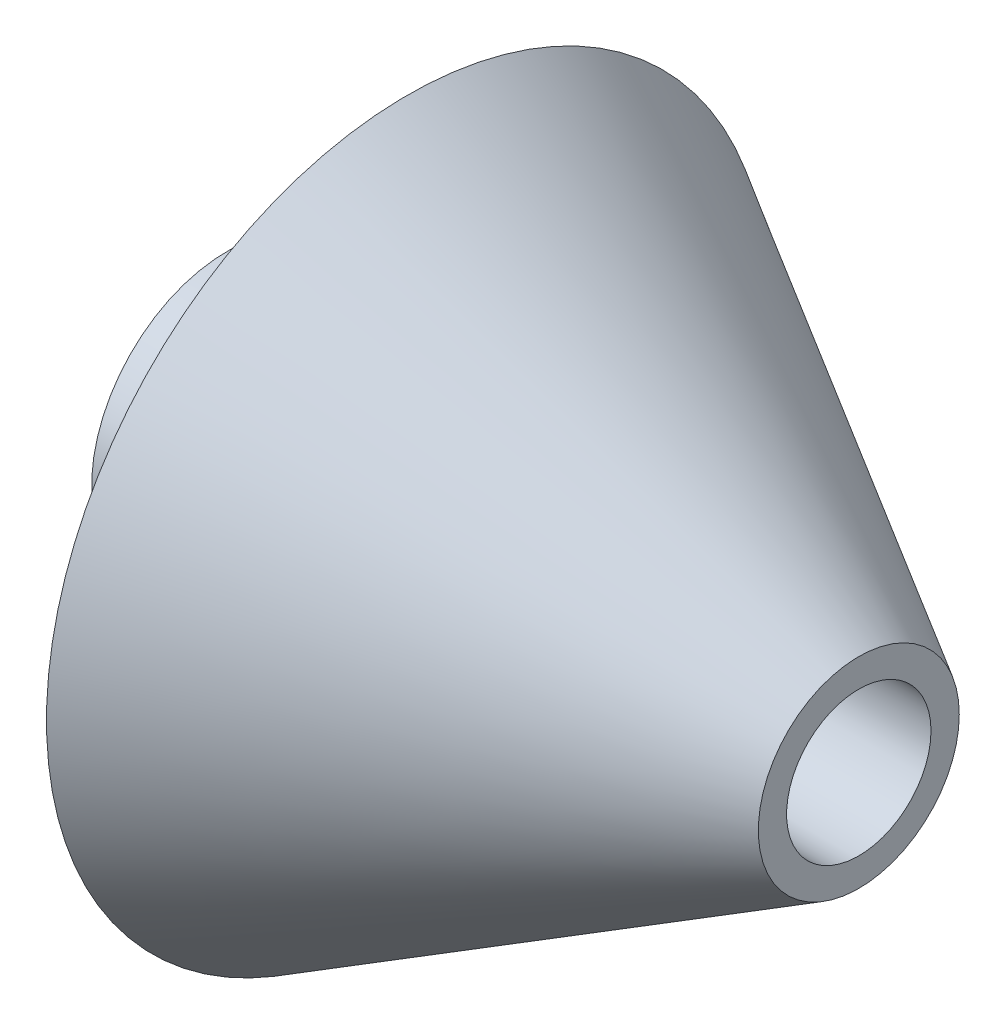
ISO-10303-21;
HEADER;
FILE_DESCRIPTION(('STEP AP214'),'2;1');
FILE_NAME('part.step','',(''),(''),'','','');
FILE_SCHEMA(('AUTOMOTIVE_DESIGN { 1 0 10303 214 1 1 1 1 }'));
ENDSEC;
DATA;
#1=APPLICATION_CONTEXT('core data for automotive mechanical design processes');
#2=APPLICATION_PROTOCOL_DEFINITION('international standard','automotive_design',2000,#1);
#3=PRODUCT_CONTEXT('',#1,'mechanical');
#4=PRODUCT('Part','Part','',(#3));
#5=PRODUCT_RELATED_PRODUCT_CATEGORY('part','',(#4));
#6=PRODUCT_DEFINITION_FORMATION('','',#4);
#7=PRODUCT_DEFINITION_CONTEXT('part definition',#1,'design');
#8=PRODUCT_DEFINITION('design','',#6,#7);
#9=PRODUCT_DEFINITION_SHAPE('','',#8);
#10=(LENGTH_UNIT() NAMED_UNIT(*) SI_UNIT(.MILLI.,.METRE.));
#11=(NAMED_UNIT(*) PLANE_ANGLE_UNIT() SI_UNIT($,.RADIAN.));
#12=(NAMED_UNIT(*) SI_UNIT($,.STERADIAN.) SOLID_ANGLE_UNIT());
#13=UNCERTAINTY_MEASURE_WITH_UNIT(LENGTH_MEASURE(1.E-05),#10,'distance_accuracy_value','');
#14=(GEOMETRIC_REPRESENTATION_CONTEXT(3) GLOBAL_UNCERTAINTY_ASSIGNED_CONTEXT((#13)) GLOBAL_UNIT_ASSIGNED_CONTEXT((#10,
#11,#12)) REPRESENTATION_CONTEXT('',''));
#15=CARTESIAN_POINT('',(0.,0.,0.));
#16=DIRECTION('',(0.,0.,1.));
#17=DIRECTION('',(1.,0.,0.));
#18=AXIS2_PLACEMENT_3D('',#15,#16,#17);
#19=CARTESIAN_POINT('',(10.,0.,0.));
#20=DIRECTION('',(-1.,0.,0.));
#21=DIRECTION('',(0.,0.,1.));
#22=AXIS2_PLACEMENT_3D('',#19,#20,#21);
#23=CYLINDRICAL_SURFACE('',#22,7.5);
#24=CARTESIAN_POINT('',(5.,7.29582462191344,1.73808604110431));
#25=CARTESIAN_POINT('',(4.8767081780864,7.29582578533876,1.73808441921809));
#26=CARTESIAN_POINT('',(4.75340116378396,7.29831884775625,1.72771516807284));
#27=CARTESIAN_POINT('',(4.51039212561209,7.30791907483883,1.68663890552692));
#28=CARTESIAN_POINT('',(4.3906913202478,7.31502778118994,1.65592509870683));
#29=CARTESIAN_POINT('',(4.1584479075924,7.33279943339759,1.57535296806255));
#30=CARTESIAN_POINT('',(4.04589375555037,7.34345646386681,1.5255264859684));
#31=CARTESIAN_POINT('',(3.83056709900705,7.36682831501832,1.4083313365412));
#32=CARTESIAN_POINT('',(3.72779606197334,7.3795434436454,1.34096004313002));
#33=CARTESIAN_POINT('',(3.53170041413394,7.40566220817689,1.18840702692507));
#34=CARTESIAN_POINT('',(3.43873115308057,7.41907513202254,1.10277001429896));
#35=CARTESIAN_POINT('',(3.26804307301624,7.44428964409016,0.917226899043463));
#36=CARTESIAN_POINT('',(3.19032621432518,7.45609102512884,0.817318965086769));
#37=CARTESIAN_POINT('',(3.05080595025004,7.47645447792517,0.603627500265013));
#38=CARTESIAN_POINT('',(2.98936486333579,7.48494451538182,0.489599753162261));
#39=CARTESIAN_POINT('',(2.88651911143587,7.49668291516818,0.252585901676565));
#40=CARTESIAN_POINT('',(2.84511012521383,7.49993240831827,0.129601735924405));
#41=CARTESIAN_POINT('',(2.78467999836424,7.50006356854545,-0.118033583608461));
#42=CARTESIAN_POINT('',(2.76505230852095,7.49712473693507,-0.242536409879433));
#43=CARTESIAN_POINT('',(2.74682401303034,7.48484294070182,-0.492748916896022));
#44=CARTESIAN_POINT('',(2.74821899089706,7.47550132158353,-0.61845833861195));
#45=CARTESIAN_POINT('',(2.77158930281454,7.45113461963631,-0.863281957222159));
#46=CARTESIAN_POINT('',(2.7929077907148,7.43630001528748,-0.982478693202047));
#47=CARTESIAN_POINT('',(2.85444700399144,7.40184054195606,-1.21515294249028));
#48=CARTESIAN_POINT('',(2.89466892641401,7.38221536965206,-1.3286300931061));
#49=CARTESIAN_POINT('',(2.99331803512784,7.33931843955883,-1.54825090295519));
#50=CARTESIAN_POINT('',(3.0519518042109,7.31600687177091,-1.65429375421843));
#51=CARTESIAN_POINT('',(3.18559677864234,7.26769334295043,-1.85507770750856));
#52=CARTESIAN_POINT('',(3.26061186944523,7.24269098185471,-1.94981611999905));
#53=CARTESIAN_POINT('',(3.4282966261274,7.19203086420685,-2.12925466018726));
#54=CARTESIAN_POINT('',(3.52153537854461,7.16638499638598,-2.21342704616745));
#55=CARTESIAN_POINT('',(3.72126502683508,7.11773406341157,-2.36521278353643));
#56=CARTESIAN_POINT('',(3.82775723808385,7.09472926081401,-2.43282448933589));
#57=CARTESIAN_POINT('',(4.05235920387348,7.0533901371112,-2.55021857579199));
#58=CARTESIAN_POINT('',(4.17057056879438,7.03510271737461,-2.5998237710279));
#59=CARTESIAN_POINT('',(4.41441081266832,7.0054564081845,-2.67868922849804));
#60=CARTESIAN_POINT('',(4.54003725730184,6.99409525860799,-2.70795612779274));
#61=CARTESIAN_POINT('',(4.79012354110892,6.97986823780215,-2.74441441642579));
#62=CARTESIAN_POINT('',(4.91445233584097,6.97670150821491,-2.75238796025694));
#63=CARTESIAN_POINT('',(5.1627093500148,6.97833930387089,-2.74823345305454));
#64=CARTESIAN_POINT('',(5.28663762309627,6.98314271328774,-2.73610821586802));
#65=CARTESIAN_POINT('',(5.52723256695631,6.99996360645724,-2.69277185685859));
#66=CARTESIAN_POINT('',(5.64400424639528,7.01179043634496,-2.66206474422851));
#67=CARTESIAN_POINT('',(5.87060253622238,7.04131123187629,-2.58296466630633));
#68=CARTESIAN_POINT('',(5.98042807121085,7.05900610337334,-2.53456897029808));
#69=CARTESIAN_POINT('',(6.1932761961082,7.09914564270398,-2.41989779964394));
#70=CARTESIAN_POINT('',(6.29603708147869,7.12170504697062,-2.35317729920291));
#71=CARTESIAN_POINT('',(6.48895715927121,7.16922250909264,-2.20416727666842));
#72=CARTESIAN_POINT('',(6.57911332641918,7.19418114037205,-2.12187402805649));
#73=CARTESIAN_POINT('',(6.7477706087221,7.24532058841136,-1.94024373790255));
#74=CARTESIAN_POINT('',(6.82570344348047,7.27151198137408,-1.84038066945645));
#75=CARTESIAN_POINT('',(6.96345005154163,7.32189833056559,-1.62839079479818));
#76=CARTESIAN_POINT('',(7.02326472467219,7.34609338589786,-1.51626459800359));
#77=CARTESIAN_POINT('',(7.12250004585244,7.39028649297591,-1.2835763100187));
#78=CARTESIAN_POINT('',(7.16207302423846,7.41031519980201,-1.16308521973277));
#79=CARTESIAN_POINT('',(7.22009137833563,7.44484796656302,-0.916368390195936));
#80=CARTESIAN_POINT('',(7.23854279892263,7.45935360637634,-0.790144302455321));
#81=CARTESIAN_POINT('',(7.25333456608175,7.48148849999798,-0.540742826239007));
#82=CARTESIAN_POINT('',(7.25049904311175,7.48936105039222,-0.417635301209565));
#83=CARTESIAN_POINT('',(7.22476755125132,7.49899415973435,-0.173303016696191));
#84=CARTESIAN_POINT('',(7.20187271977934,7.50075506520139,-0.0520781508569035));
#85=CARTESIAN_POINT('',(7.13718250790056,7.49866714154556,0.183739659865865));
#86=CARTESIAN_POINT('',(7.09559272902648,7.49487834888372,0.2983898420966));
#87=CARTESIAN_POINT('',(6.99487712823921,7.48280968580673,0.519449471297491));
#88=CARTESIAN_POINT('',(6.93574842457071,7.4745290771726,0.625857560413855));
#89=CARTESIAN_POINT('',(6.79943981385495,7.45455263671726,0.831033074447341));
#90=CARTESIAN_POINT('',(6.72174285499885,7.44275600496553,0.929447075633607));
#91=CARTESIAN_POINT('',(6.5514344175008,7.41764997770358,1.11220275729975));
#92=CARTESIAN_POINT('',(6.45881864315277,7.40434014681033,1.19654037035669));
#93=CARTESIAN_POINT('',(6.25798883253424,7.37771661499368,1.35116526055005));
#94=CARTESIAN_POINT('',(6.14939216991434,7.36441462190377,1.42095885796911));
#95=CARTESIAN_POINT('',(5.92166723875847,7.34023484572542,1.54101414244782));
#96=CARTESIAN_POINT('',(5.80254406459821,7.32935589886509,1.59128521470233));
#97=CARTESIAN_POINT('',(5.57038935259059,7.31265633349442,1.66624403033643));
#98=CARTESIAN_POINT('',(5.45808702960351,7.30641663081895,1.6931066541507));
#99=CARTESIAN_POINT('',(5.23052716625634,7.29800063846268,1.72902663298082));
#100=CARTESIAN_POINT('',(5.11527022303213,7.29582353418277,1.73808755746755));
#101=CARTESIAN_POINT('',(5.,7.29582462191344,1.73808604110431));
#102=B_SPLINE_CURVE_WITH_KNOTS('',3,(#24,#25,#26,#27,#28,#29,#30,#31,#32,#33,#34,#35,#36,#37,
#38,#39,#40,#41,#42,#43,#44,#45,#46,#47,#48,#49,#50,#51,#52,#53,#54,#55,#56,#57,#58,#59,#60,#61,
#62,#63,#64,#65,#66,#67,#68,#69,#70,#71,#72,#73,#74,#75,#76,#77,#78,#79,#80,#81,#82,#83,#84,#85,
#86,#87,#88,#89,#90,#91,#92,#93,#94,#95,#96,#97,#98,#99,#100,#101),.UNSPECIFIED.,.T.,.F.,(4,2,2,
2,2,2,2,2,2,2,2,2,2,2,2,2,2,2,2,2,2,2,2,2,2,2,2,2,2,2,2,2,2,2,2,2,2,2,4),(0.,0.369450248873314,
0.739023962533499,1.10798462169929,1.47700053805515,1.85659725011976,2.23624271806909,
2.62373908910467,3.01115183381815,3.38748210224336,3.7637333115216,4.1280018898632,
4.49229353835564,4.86082814003514,5.22945024886245,5.61228220534916,5.99515218737794,
6.38169357369399,6.76810875942617,7.14012121185464,7.51208158661081,7.87437892408225,
8.23673221568681,8.60881097714082,8.98097888893384,9.36719259150903,9.75338710986302,
10.1366308772149,10.5197649348252,10.8881445586683,11.2565032957163,11.6209064530833,
11.9853695173707,12.3614944058173,12.7377277894483,13.1251745950372,13.5124349094592,
13.8579173078617,14.2033304255034),.UNSPECIFIED.);
#103=CARTESIAN_POINT('',(5.,7.29582462191344,1.73808604110431));
#104=VERTEX_POINT('',#103);
#105=EDGE_CURVE('E55',#104,#104,#102,.T.);
#106=ORIENTED_EDGE('',*,*,#105,.T.);
#107=EDGE_LOOP('',(#106));
#108=FACE_BOUND('',#107,.T.);
#109=CARTESIAN_POINT('',(10.,0.,0.));
#110=DIRECTION('',(1.,0.,0.));
#111=DIRECTION('',(0.,0.,-1.));
#112=AXIS2_PLACEMENT_3D('',#109,#110,#111);
#113=CIRCLE('',#112,7.5);
#114=CARTESIAN_POINT('',(10.,0.,-7.5));
#115=VERTEX_POINT('',#114);
#116=EDGE_CURVE('E10',#115,#115,#113,.T.);
#117=ORIENTED_EDGE('',*,*,#116,.F.);
#118=EDGE_LOOP('',(#117));
#119=FACE_BOUND('',#118,.T.);
#120=CARTESIAN_POINT('',(0.,0.,0.));
#121=DIRECTION('',(1.,0.,0.));
#122=DIRECTION('',(0.,0.,-1.));
#123=AXIS2_PLACEMENT_3D('',#120,#121,#122);
#124=CIRCLE('',#123,7.5);
#125=CARTESIAN_POINT('',(0.,0.,-7.5));
#126=VERTEX_POINT('',#125);
#127=EDGE_CURVE('E35',#126,#126,#124,.T.);
#128=ORIENTED_EDGE('',*,*,#127,.T.);
#129=EDGE_LOOP('',(#128));
#130=FACE_BOUND('',#129,.T.);
#131=ADVANCED_FACE('F31',(#108,#119,#130),#23,.T.);
#132=CARTESIAN_POINT('',(0.,0.,0.));
#133=DIRECTION('',(1.,0.,0.));
#134=DIRECTION('',(0.,0.,-1.));
#135=AXIS2_PLACEMENT_3D('',#132,#133,#134);
#136=PLANE('',#135);
#137=CARTESIAN_POINT('',(0.,0.,0.));
#138=DIRECTION('',(1.,0.,0.));
#139=DIRECTION('',(0.,0.,-1.));
#140=AXIS2_PLACEMENT_3D('',#137,#138,#139);
#141=CIRCLE('',#140,4.);
#142=CARTESIAN_POINT('',(0.,0.,-4.));
#143=VERTEX_POINT('',#142);
#144=EDGE_CURVE('E49',#143,#143,#141,.T.);
#145=ORIENTED_EDGE('',*,*,#144,.T.);
#146=EDGE_LOOP('',(#145));
#147=FACE_BOUND('',#146,.T.);
#148=ORIENTED_EDGE('',*,*,#127,.F.);
#149=EDGE_LOOP('',(#148));
#150=FACE_BOUND('',#149,.T.);
#151=ADVANCED_FACE('F84',(#147,#150),#136,.F.);
#152=CARTESIAN_POINT('',(10.,0.,0.));
#153=DIRECTION('',(1.,0.,0.));
#154=DIRECTION('',(0.,0.,-1.));
#155=AXIS2_PLACEMENT_3D('',#152,#153,#154);
#156=PLANE('',#155);
#157=CARTESIAN_POINT('',(10.,0.,0.));
#158=DIRECTION('',(1.,0.,0.));
#159=DIRECTION('',(0.,0.,-1.));
#160=AXIS2_PLACEMENT_3D('',#157,#158,#159);
#161=CIRCLE('',#160,20.);
#162=CARTESIAN_POINT('',(10.,0.,-20.));
#163=VERTEX_POINT('',#162);
#164=EDGE_CURVE('E46',#163,#163,#161,.T.);
#165=ORIENTED_EDGE('',*,*,#164,.F.);
#166=EDGE_LOOP('',(#165));
#167=FACE_BOUND('',#166,.T.);
#168=ORIENTED_EDGE('',*,*,#116,.T.);
#169=EDGE_LOOP('',(#168));
#170=FACE_BOUND('',#169,.T.);
#171=ADVANCED_FACE('F81',(#167,#170),#156,.F.);
#172=CARTESIAN_POINT('',(10.,0.,0.));
#173=DIRECTION('',(-1.,0.,0.));
#174=DIRECTION('',(0.,0.,-1.));
#175=AXIS2_PLACEMENT_3D('',#172,#173,#174);
#176=CONICAL_SURFACE('',#175,20.,0.5235987755983);
#177=CARTESIAN_POINT('',(35.,0.,0.));
#178=DIRECTION('',(1.,0.,0.));
#179=DIRECTION('',(0.,0.,-1.));
#180=AXIS2_PLACEMENT_3D('',#177,#178,#179);
#181=CIRCLE('',#180,5.56624327025932);
#182=CARTESIAN_POINT('',(35.,0.,-5.56624327025932));
#183=VERTEX_POINT('',#182);
#184=EDGE_CURVE('E42',#183,#183,#181,.T.);
#185=CARTESIAN_POINT('',(35.,0.,-5.56624327025932));
#186=CARTESIAN_POINT('',(34.7395833333333,0.,-5.71659490286078));
#187=CARTESIAN_POINT('',(34.4791666666667,0.,-5.86694653546225));
#188=CARTESIAN_POINT('',(33.9583333333333,0.,-6.16764980066518));
#189=CARTESIAN_POINT('',(33.6979166666667,0.,-6.31800143326665));
#190=CARTESIAN_POINT('',(33.1770833333333,0.,-6.61870469846958));
#191=CARTESIAN_POINT('',(32.9166666666667,0.,-6.76905633107104));
#192=CARTESIAN_POINT('',(32.3958333333333,0.,-7.06975959627397));
#193=CARTESIAN_POINT('',(32.1354166666667,0.,-7.22011122887544));
#194=CARTESIAN_POINT('',(31.6145833333333,0.,-7.52081449407837));
#195=CARTESIAN_POINT('',(31.3541666666667,0.,-7.67116612667983));
#196=CARTESIAN_POINT('',(30.8333333333333,0.,-7.97186939188277));
#197=CARTESIAN_POINT('',(30.5729166666667,0.,-8.12222102448423));
#198=CARTESIAN_POINT('',(30.0520833333333,0.,-8.42292428968716));
#199=CARTESIAN_POINT('',(29.7916666666667,0.,-8.57327592228863));
#200=CARTESIAN_POINT('',(29.2708333333333,0.,-8.87397918749156));
#201=CARTESIAN_POINT('',(29.0104166666667,0.,-9.02433082009302));
#202=CARTESIAN_POINT('',(28.4895833333333,0.,-9.32503408529595));
#203=CARTESIAN_POINT('',(28.2291666666667,0.,-9.47538571789742));
#204=CARTESIAN_POINT('',(27.7083333333333,0.,-9.77608898310035));
#205=CARTESIAN_POINT('',(27.4479166666667,0.,-9.92644061570181));
#206=CARTESIAN_POINT('',(26.9270833333333,0.,-10.2271438809047));
#207=CARTESIAN_POINT('',(26.6666666666667,0.,-10.3774955135062));
#208=CARTESIAN_POINT('',(26.1458333333333,0.,-10.6781987787091));
#209=CARTESIAN_POINT('',(25.8854166666667,0.,-10.8285504113106));
#210=CARTESIAN_POINT('',(25.3645833333333,0.,-11.1292536765135));
#211=CARTESIAN_POINT('',(25.1041666666667,0.,-11.279605309115));
#212=CARTESIAN_POINT('',(24.5833333333333,0.,-11.5803085743179));
#213=CARTESIAN_POINT('',(24.3229166666667,0.,-11.7306602069194));
#214=CARTESIAN_POINT('',(23.8020833333333,0.,-12.0313634721223));
#215=CARTESIAN_POINT('',(23.5416666666667,0.,-12.1817151047238));
#216=CARTESIAN_POINT('',(23.0208333333333,0.,-12.4824183699267));
#217=CARTESIAN_POINT('',(22.7604166666667,0.,-12.6327700025282));
#218=CARTESIAN_POINT('',(22.2395833333333,0.,-12.9334732677311));
#219=CARTESIAN_POINT('',(21.9791666666667,0.,-13.0838249003326));
#220=CARTESIAN_POINT('',(21.4583333333333,0.,-13.3845281655355));
#221=CARTESIAN_POINT('',(21.1979166666667,0.,-13.534879798137));
#222=CARTESIAN_POINT('',(20.6770833333333,0.,-13.8355830633399));
#223=CARTESIAN_POINT('',(20.4166666666667,0.,-13.9859346959414));
#224=CARTESIAN_POINT('',(19.8958333333333,0.,-14.2866379611443));
#225=CARTESIAN_POINT('',(19.6354166666667,0.,-14.4369895937458));
#226=CARTESIAN_POINT('',(19.1145833333333,0.,-14.7376928589487));
#227=CARTESIAN_POINT('',(18.8541666666667,0.,-14.8880444915502));
#228=CARTESIAN_POINT('',(18.3333333333333,0.,-15.1887477567531));
#229=CARTESIAN_POINT('',(18.0729166666667,0.,-15.3390993893546));
#230=CARTESIAN_POINT('',(17.5520833333333,0.,-15.6398026545575));
#231=CARTESIAN_POINT('',(17.2916666666667,0.,-15.790154287159));
#232=CARTESIAN_POINT('',(16.7708333333333,0.,-16.0908575523619));
#233=CARTESIAN_POINT('',(16.5104166666667,0.,-16.2412091849634));
#234=CARTESIAN_POINT('',(15.9895833333333,0.,-16.5419124501663));
#235=CARTESIAN_POINT('',(15.7291666666667,0.,-16.6922640827678));
#236=CARTESIAN_POINT('',(15.2083333333333,0.,-16.9929673479707));
#237=CARTESIAN_POINT('',(14.9479166666667,0.,-17.1433189805722));
#238=CARTESIAN_POINT('',(14.4270833333333,0.,-17.4440222457751));
#239=CARTESIAN_POINT('',(14.1666666666667,0.,-17.5943738783766));
#240=CARTESIAN_POINT('',(13.6458333333333,0.,-17.8950771435795));
#241=CARTESIAN_POINT('',(13.3854166666667,0.,-18.045428776181));
#242=CARTESIAN_POINT('',(12.8645833333333,0.,-18.3461320413839));
#243=CARTESIAN_POINT('',(12.6041666666667,0.,-18.4964836739853));
#244=CARTESIAN_POINT('',(12.0833333333333,0.,-18.7971869391883));
#245=CARTESIAN_POINT('',(11.8229166666667,0.,-18.9475385717897));
#246=CARTESIAN_POINT('',(11.3020833333333,0.,-19.2482418369927));
#247=CARTESIAN_POINT('',(11.0416666666667,0.,-19.3985934695941));
#248=CARTESIAN_POINT('',(10.5208333333333,0.,-19.6992967347971));
#249=CARTESIAN_POINT('',(10.2604166666667,0.,-19.8496483673985));
#250=CARTESIAN_POINT('',(10.,0.,-20.));
#251=B_SPLINE_CURVE_WITH_KNOTS('',3,(#185,#186,#187,#188,#189,#190,#191,#192,#193,#194,#195,
#196,#197,#198,#199,#200,#201,#202,#203,#204,#205,#206,#207,#208,#209,#210,#211,#212,#213,#214,
#215,#216,#217,#218,#219,#220,#221,#222,#223,#224,#225,#226,#227,#228,#229,#230,#231,#232,#233,
#234,#235,#236,#237,#238,#239,#240,#241,#242,#243,#244,#245,#246,#247,#248,#249,#250),
.UNSPECIFIED.,.F.,.F.,(4,2,2,2,2,2,2,2,2,2,2,2,2,2,2,2,2,2,2,2,2,2,2,2,2,2,2,2,2,2,2,2,4),(0.,
0.902109795608795,1.80421959121758,2.70632938682637,3.60843918243517,4.51054897804395,
5.41265877365275,6.31476856926154,7.21687836487032,8.11898816047912,9.02109795608791,
9.9232077516967,10.8253175473055,11.7274273429143,12.6295371385231,13.5316469341319,
14.4337567297407,15.3358665253494,16.2379763209582,17.140086116567,18.0421959121758,
18.9443057077846,19.8464155033934,20.7485252990022,21.650635094611,22.5527448902198,
23.4548546858286,24.3569644814374,25.2590742770462,26.1611840726549,27.0632938682637,
27.9654036638725,28.8675134594813),.UNSPECIFIED.);
#252=EDGE_CURVE('BSEAM79',#183,#163,#251,.T.);
#253=ORIENTED_EDGE('',*,*,#184,.F.);
#254=ORIENTED_EDGE('',*,*,#164,.T.);
#255=ORIENTED_EDGE('',*,*,#252,.T.);
#256=ORIENTED_EDGE('',*,*,#252,.F.);
#257=EDGE_LOOP('',(#253,#255,#254,#256));
#258=FACE_BOUND('',#257,.T.);
#259=ADVANCED_FACE('F79',(#258),#176,.T.);
#260=CARTESIAN_POINT('',(35.,0.,0.));
#261=DIRECTION('',(1.,0.,0.));
#262=DIRECTION('',(0.,0.,-1.));
#263=AXIS2_PLACEMENT_3D('',#260,#261,#262);
#264=PLANE('',#263);
#265=CARTESIAN_POINT('',(35.,0.,0.));
#266=DIRECTION('',(1.,0.,0.));
#267=DIRECTION('',(0.,0.,-1.));
#268=AXIS2_PLACEMENT_3D('',#265,#266,#267);
#269=CIRCLE('',#268,4.);
#270=CARTESIAN_POINT('',(35.,0.,-4.));
#271=VERTEX_POINT('',#270);
#272=EDGE_CURVE('E52',#271,#271,#269,.T.);
#273=ORIENTED_EDGE('',*,*,#272,.F.);
#274=EDGE_LOOP('',(#273));
#275=FACE_BOUND('',#274,.T.);
#276=ORIENTED_EDGE('',*,*,#184,.T.);
#277=EDGE_LOOP('',(#276));
#278=FACE_BOUND('',#277,.T.);
#279=ADVANCED_FACE('F75',(#275,#278),#264,.T.);
#280=CARTESIAN_POINT('',(-35.,0.,0.));
#281=DIRECTION('',(1.,0.,0.));
#282=DIRECTION('',(0.,0.,-1.));
#283=AXIS2_PLACEMENT_3D('',#280,#281,#282);
#284=CYLINDRICAL_SURFACE('',#283,4.);
#285=CARTESIAN_POINT('',(5.,3.45811433735363,2.01033460642482));
#286=CARTESIAN_POINT('',(5.11479177298601,3.4581272872223,2.01032364856623));
#287=CARTESIAN_POINT('',(5.22967680097599,3.46354590980055,2.00107977596369));
#288=CARTESIAN_POINT('',(5.45571959731425,3.48429505941307,1.96471217047805));
#289=CARTESIAN_POINT('',(5.56687112580827,3.49964138844542,1.93755993137688));
#290=CARTESIAN_POINT('',(5.78171749733832,3.53769065892239,1.86716843531779));
#291=CARTESIAN_POINT('',(5.88545568309775,3.56034567315265,1.82403371808911));
#292=CARTESIAN_POINT('',(6.08446410750252,3.61014410680161,1.72337044721633));
#293=CARTESIAN_POINT('',(6.17973232492404,3.63728859316501,1.66583847032256));
#294=CARTESIAN_POINT('',(6.37021368608448,3.69619006956614,1.53105749297772));
#295=CARTESIAN_POINT('',(6.46434831480084,3.72813086275212,1.4523640853639));
#296=CARTESIAN_POINT('',(6.63936841298579,3.79049462961051,1.28081551442058));
#297=CARTESIAN_POINT('',(6.72024553824001,3.82091663905504,1.18795150262325));
#298=CARTESIAN_POINT('',(6.87371148523836,3.87955696816397,0.980640461605691));
#299=CARTESIAN_POINT('',(6.9448757715501,3.90732264022884,0.864998271539078));
#300=CARTESIAN_POINT('',(7.06661429386831,3.95334197874954,0.621592398870603));
#301=CARTESIAN_POINT('',(7.11720494073854,3.97160322981236,0.493838478079167));
#302=CARTESIAN_POINT('',(7.19174990423831,3.9945265640937,0.24162448462837));
#303=CARTESIAN_POINT('',(7.21762481450363,4.00022547057301,0.117830223586463));
#304=CARTESIAN_POINT('',(7.24843078948777,3.99976146804044,-0.132288893341635));
#305=CARTESIAN_POINT('',(7.25337863632572,3.99360806955849,-0.258611639831057));
#306=CARTESIAN_POINT('',(7.24269151733192,3.97079330938818,-0.495371614981288));
#307=CARTESIAN_POINT('',(7.22924888337169,3.95535503716824,-0.606034969884377));
#308=CARTESIAN_POINT('',(7.18623202092011,3.91604779149938,-0.822606871048774));
#309=CARTESIAN_POINT('',(7.15665654294866,3.89217816509708,-0.928515048336416));
#310=CARTESIAN_POINT('',(7.08227541042689,3.83735990512779,-1.13406647703929));
#311=CARTESIAN_POINT('',(7.03732468634712,3.80634479710947,-1.23363892589054));
#312=CARTESIAN_POINT('',(6.93380432524612,3.73944899374294,-1.42361455756465));
#313=CARTESIAN_POINT('',(6.87523051267075,3.70356680801602,-1.51401491686379));
#314=CARTESIAN_POINT('',(6.73874562980042,3.62509644890928,-1.6939128322954));
#315=CARTESIAN_POINT('',(6.65941015281099,3.58220594762675,-1.78219748258282));
#316=CARTESIAN_POINT('',(6.48736365380543,3.49656842702649,-1.94485945330759));
#317=CARTESIAN_POINT('',(6.39463801984632,3.45382161734346,-2.01922137437031));
#318=CARTESIAN_POINT('',(6.1879665563582,3.36829601636845,-2.1591472278605));
#319=CARTESIAN_POINT('',(6.07284365118137,3.32589557336124,-2.22321672823089));
#320=CARTESIAN_POINT('',(5.83043916789798,3.25107059304276,-2.33128828704761));
#321=CARTESIAN_POINT('',(5.70317187724139,3.21863451809617,-2.37531358316751));
#322=CARTESIAN_POINT('',(5.5112934182758,3.18244089718883,-2.4233068071129));
#323=CARTESIAN_POINT('',(5.44990235098741,3.17265049878655,-2.4360736010235));
#324=CARTESIAN_POINT('',(5.32585093561637,3.15670495885536,-2.45670265491584));
#325=CARTESIAN_POINT('',(5.26319137167983,3.15054763841031,-2.46456785475787));
#326=CARTESIAN_POINT('',(5.13723291808639,3.14216053466889,-2.47525236937524));
#327=CARTESIAN_POINT('',(5.07393461222905,3.139927443157,-2.47807593439737));
#328=CARTESIAN_POINT('',(4.94732201512168,3.13947608348779,-2.47864590128515));
#329=CARTESIAN_POINT('',(4.88400772678837,3.14125732244709,-2.47639292645331));
#330=CARTESIAN_POINT('',(4.71463173850526,3.15136148044073,-2.46354534546038));
#331=CARTESIAN_POINT('',(4.60909251899474,3.16333854444857,-2.44828247550563));
#332=CARTESIAN_POINT('',(4.40260392124326,3.19704518276601,-2.40409001873355));
#333=CARTESIAN_POINT('',(4.30165677777346,3.21877945074323,-2.37515385407476));
#334=CARTESIAN_POINT('',(4.1023712596773,3.27062983489866,-2.30326141434753));
#335=CARTESIAN_POINT('',(4.00429845856983,3.30104626814879,-2.25979095345306));
#336=CARTESIAN_POINT('',(3.81659989404072,3.36697540337568,-2.16033200724061));
#337=CARTESIAN_POINT('',(3.7269782010505,3.40249054055335,-2.10433753313574));
#338=CARTESIAN_POINT('',(3.54300310928209,3.48204565372015,-1.97037749056845));
#339=CARTESIAN_POINT('',(3.45036390599711,3.52651814227246,-1.890303742227));
#340=CARTESIAN_POINT('',(3.27960945170775,3.61478299621542,-1.71549964675364));
#341=CARTESIAN_POINT('',(3.2015037626183,3.65857489659275,-1.62075972497899));
#342=CARTESIAN_POINT('',(3.05777260443435,3.74425179236784,-1.41209293572753));
#343=CARTESIAN_POINT('',(2.99313387496689,3.78587882613099,-1.29737187748106));
#344=CARTESIAN_POINT('',(2.88520723884704,3.86024500507964,-1.05566668697368));
#345=CARTESIAN_POINT('',(2.84189639869571,3.89299367989403,-0.928695903155916));
#346=CARTESIAN_POINT('',(2.78236341992748,3.94357340735712,-0.680156426083052));
#347=CARTESIAN_POINT('',(2.76379705036529,3.96259964498872,-0.559393962799611));
#348=CARTESIAN_POINT('',(2.74687623010184,3.98944330601647,-0.315256221061846));
#349=CARTESIAN_POINT('',(2.74850999667981,3.99726726072218,-0.191882507672344));
#350=CARTESIAN_POINT('',(2.77072877000044,4.00132414896625,0.0413317595333058));
#351=CARTESIAN_POINT('',(2.78948395475744,3.99859532967875,0.151336878033622));
#352=CARTESIAN_POINT('',(2.84250836895072,3.98459805476824,0.366952025775573));
#353=CARTESIAN_POINT('',(2.87677937076476,3.97332862344868,0.472561551401608));
#354=CARTESIAN_POINT('',(2.96078046975939,3.9431920093167,0.680136152945317));
#355=CARTESIAN_POINT('',(3.01095796488639,3.92409955673835,0.781885918147401));
#356=CARTESIAN_POINT('',(3.12477358439667,3.88032735349634,0.976215506008922));
#357=CARTESIAN_POINT('',(3.18841682896608,3.85564547727115,1.06879182085964));
#358=CARTESIAN_POINT('',(3.33595747666178,3.79983045056212,1.25366441815022));
#359=CARTESIAN_POINT('',(3.42135921632251,3.76827965877607,1.34463644620943));
#360=CARTESIAN_POINT('',(3.60555081201596,3.70442117422225,1.51171477476071));
#361=CARTESIAN_POINT('',(3.70435779584759,3.67211255759459,1.58780174794252));
#362=CARTESIAN_POINT('',(3.92194251902545,3.6082027044322,1.7283772062286));
#363=CARTESIAN_POINT('',(4.04166806353952,3.57684268259026,1.79154126905867));
#364=CARTESIAN_POINT('',(4.22935346894418,3.53639868822073,1.86942224343075));
#365=CARTESIAN_POINT('',(4.29321205110379,3.52402375455466,1.89256027275369));
#366=CARTESIAN_POINT('',(4.42322518375672,3.50205798259544,1.93290380717901));
#367=CARTESIAN_POINT('',(4.48937829186373,3.49246542952001,1.95011296747907));
#368=CARTESIAN_POINT('',(4.62895731996511,3.47594519307674,1.97942340568864));
#369=CARTESIAN_POINT('',(4.70253233811763,3.46930341153932,1.99098473007536));
#370=CARTESIAN_POINT('',(4.85072515942147,3.46038399159514,2.00644350915162));
#371=CARTESIAN_POINT('',(4.92534285714772,3.45810591514558,2.01034173308897));
#372=CARTESIAN_POINT('',(5.,3.45811433735363,2.01033460642482));
#373=B_SPLINE_CURVE_WITH_KNOTS('',3,(#285,#286,#287,#288,#289,#290,#291,#292,#293,#294,#295,
#296,#297,#298,#299,#300,#301,#302,#303,#304,#305,#306,#307,#308,#309,#310,#311,#312,#313,#314,
#315,#316,#317,#318,#319,#320,#321,#322,#323,#324,#325,#326,#327,#328,#329,#330,#331,#332,#333,
#334,#335,#336,#337,#338,#339,#340,#341,#342,#343,#344,#345,#346,#347,#348,#349,#350,#351,#352,
#353,#354,#355,#356,#357,#358,#359,#360,#361,#362,#363,#364,#365,#366,#367,#368,#369,#370,#371,
#372),.UNSPECIFIED.,.T.,.F.,(4,2,2,2,2,2,2,2,2,2,2,2,2,2,2,2,2,2,2,2,2,2,2,2,2,2,2,2,2,2,2,2,2,
2,2,2,2,2,2,2,2,2,2,4),(0.,0.344066805660244,0.68868261679304,1.03108301796517,1.37356490947821,
1.75238780208417,2.13144821620348,2.54501229302033,2.95824583428633,3.33584820031543,
3.71314769676887,4.04917469578037,4.38522772359825,4.72454320749747,5.06396283090262,
5.44103976981172,5.81853134594495,6.23167855500208,6.64434556637782,6.83448583066616,
7.0245119432846,7.21437778251751,7.40422031110859,7.72451713226547,8.04496819642209,
8.37822852327227,8.7116485519921,9.1008149165147,9.49023642367205,9.90224689706152,
10.3138133702467,10.6826803049524,11.0513320900709,11.3846804478632,11.7180668937784,
12.0618158383277,12.4056957248518,12.7901872703696,13.1751747879601,13.5894788153597,
13.7963097822762,14.0030130070156,14.2268062539982,14.4505770347147),.UNSPECIFIED.);
#374=CARTESIAN_POINT('',(5.,3.45811433735363,2.01033460642482));
#375=VERTEX_POINT('',#374);
#376=EDGE_CURVE('E61',#375,#375,#373,.T.);
#377=ORIENTED_EDGE('',*,*,#376,.T.);
#378=EDGE_LOOP('',(#377));
#379=FACE_BOUND('',#378,.T.);
#380=ORIENTED_EDGE('',*,*,#272,.T.);
#381=EDGE_LOOP('',(#380));
#382=FACE_BOUND('',#381,.T.);
#383=ORIENTED_EDGE('',*,*,#144,.F.);
#384=EDGE_LOOP('',(#383));
#385=FACE_BOUND('',#384,.T.);
#386=ADVANCED_FACE('F68',(#379,#382,#385),#284,.F.);
#387=CARTESIAN_POINT('',(5.,7.48119892583749,-0.530718976529043));
#388=DIRECTION('',(0.,0.997493190111665,-0.0707625302038724));
#389=DIRECTION('',(0.,0.0707625302038724,0.997493190111665));
#390=AXIS2_PLACEMENT_3D('',#387,#388,#389);
#391=CYLINDRICAL_SURFACE('',#390,2.25);
#392=ORIENTED_EDGE('',*,*,#376,.F.);
#393=EDGE_LOOP('',(#392));
#394=FACE_BOUND('',#393,.T.);
#395=ORIENTED_EDGE('',*,*,#105,.F.);
#396=EDGE_LOOP('',(#395));
#397=FACE_BOUND('',#396,.T.);
#398=ADVANCED_FACE('F65',(#394,#397),#391,.F.);
#399=CLOSED_SHELL('',(#131,#151,#171,#259,#279,#386,#398));
#400=MANIFOLD_SOLID_BREP('B2',#399);
#401=ADVANCED_BREP_SHAPE_REPRESENTATION('',(#18,#400),#14);
#402=SHAPE_DEFINITION_REPRESENTATION(#9,#401);
ENDSEC;
END-ISO-10303-21;
